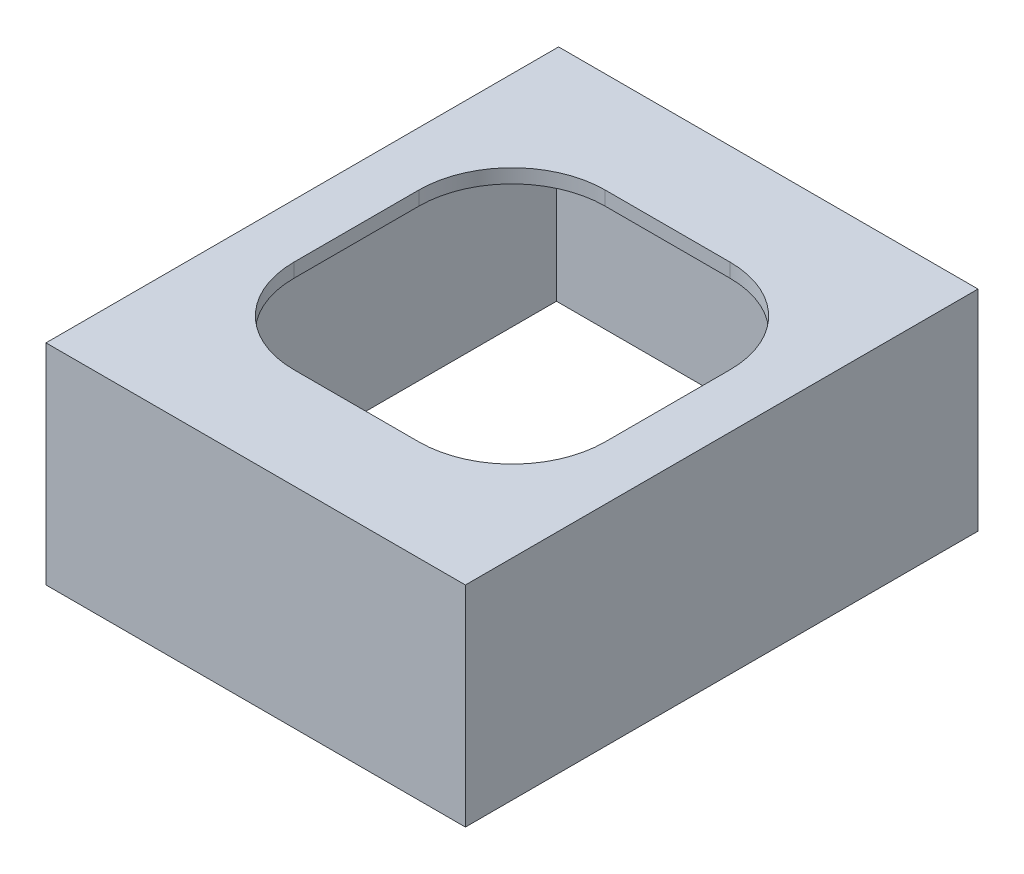
ISO-10303-21;
HEADER;
FILE_DESCRIPTION(('STEP AP214'),'2;1');
FILE_NAME('part.step','',(''),(''),'','','');
FILE_SCHEMA(('AUTOMOTIVE_DESIGN { 1 0 10303 214 1 1 1 1 }'));
ENDSEC;
DATA;
#1=APPLICATION_CONTEXT('core data for automotive mechanical design processes');
#2=APPLICATION_PROTOCOL_DEFINITION('international standard','automotive_design',2000,#1);
#3=PRODUCT_CONTEXT('',#1,'mechanical');
#4=PRODUCT('Part','Part','',(#3));
#5=PRODUCT_RELATED_PRODUCT_CATEGORY('part','',(#4));
#6=PRODUCT_DEFINITION_FORMATION('','',#4);
#7=PRODUCT_DEFINITION_CONTEXT('part definition',#1,'design');
#8=PRODUCT_DEFINITION('design','',#6,#7);
#9=PRODUCT_DEFINITION_SHAPE('','',#8);
#10=(LENGTH_UNIT() NAMED_UNIT(*) SI_UNIT(.MILLI.,.METRE.));
#11=(NAMED_UNIT(*) PLANE_ANGLE_UNIT() SI_UNIT($,.RADIAN.));
#12=(NAMED_UNIT(*) SI_UNIT($,.STERADIAN.) SOLID_ANGLE_UNIT());
#13=UNCERTAINTY_MEASURE_WITH_UNIT(LENGTH_MEASURE(1.E-05),#10,'distance_accuracy_value','');
#14=(GEOMETRIC_REPRESENTATION_CONTEXT(3) GLOBAL_UNCERTAINTY_ASSIGNED_CONTEXT((#13)) GLOBAL_UNIT_ASSIGNED_CONTEXT((#10,
#11,#12)) REPRESENTATION_CONTEXT('',''));
#15=CARTESIAN_POINT('',(0.,0.,0.));
#16=DIRECTION('',(0.,0.,1.));
#17=DIRECTION('',(1.,0.,0.));
#18=AXIS2_PLACEMENT_3D('',#15,#16,#17);
#19=CARTESIAN_POINT('',(45.,9.45,55.));
#20=DIRECTION('',(1.,0.,0.));
#21=DIRECTION('',(0.,0.,-1.));
#22=AXIS2_PLACEMENT_3D('',#19,#20,#21);
#23=PLANE('',#22);
#24=DIRECTION('',(0.,0.,-1.));
#25=VECTOR('',#24,1.);
#26=CARTESIAN_POINT('',(45.,12.45,55.));
#27=LINE('',#26,#25);
#28=CARTESIAN_POINT('',(45.,12.45,55.));
#29=VERTEX_POINT('',#28);
#30=CARTESIAN_POINT('',(45.,12.45,-55.));
#31=VERTEX_POINT('',#30);
#32=EDGE_CURVE('E243',#29,#31,#27,.T.);
#33=ORIENTED_EDGE('',*,*,#32,.F.);
#34=DIRECTION('',(0.,1.,0.));
#35=VECTOR('',#34,1.);
#36=CARTESIAN_POINT('',(45.,9.45,55.));
#37=LINE('',#36,#35);
#38=CARTESIAN_POINT('',(45.,-32.55,55.));
#39=VERTEX_POINT('',#38);
#40=EDGE_CURVE('E11',#39,#29,#37,.T.);
#41=ORIENTED_EDGE('',*,*,#40,.F.);
#42=DIRECTION('',(0.,0.,1.));
#43=VECTOR('',#42,1.);
#44=CARTESIAN_POINT('',(45.,-32.55,55.));
#45=LINE('',#44,#43);
#46=CARTESIAN_POINT('',(45.,-32.55,-55.));
#47=VERTEX_POINT('',#46);
#48=EDGE_CURVE('E160',#47,#39,#45,.T.);
#49=ORIENTED_EDGE('',*,*,#48,.F.);
#50=DIRECTION('',(0.,1.,0.));
#51=VECTOR('',#50,1.);
#52=CARTESIAN_POINT('',(45.,9.45,-55.));
#53=LINE('',#52,#51);
#54=EDGE_CURVE('E36',#47,#31,#53,.T.);
#55=ORIENTED_EDGE('',*,*,#54,.T.);
#56=EDGE_LOOP('',(#33,#41,#49,#55));
#57=FACE_BOUND('',#56,.T.);
#58=ADVANCED_FACE('F33',(#57),#23,.T.);
#59=CARTESIAN_POINT('',(-45.,9.45,55.));
#60=DIRECTION('',(0.,0.,1.));
#61=DIRECTION('',(1.,0.,0.));
#62=AXIS2_PLACEMENT_3D('',#59,#60,#61);
#63=PLANE('',#62);
#64=DIRECTION('',(1.,0.,0.));
#65=VECTOR('',#64,1.);
#66=CARTESIAN_POINT('',(-45.,12.45,55.));
#67=LINE('',#66,#65);
#68=CARTESIAN_POINT('',(-45.,12.45,55.));
#69=VERTEX_POINT('',#68);
#70=EDGE_CURVE('E266',#69,#29,#67,.T.);
#71=ORIENTED_EDGE('',*,*,#70,.F.);
#72=DIRECTION('',(0.,1.,0.));
#73=VECTOR('',#72,1.);
#74=CARTESIAN_POINT('',(-45.,9.45,55.));
#75=LINE('',#74,#73);
#76=CARTESIAN_POINT('',(-45.,-32.55,55.));
#77=VERTEX_POINT('',#76);
#78=EDGE_CURVE('E41',#77,#69,#75,.T.);
#79=ORIENTED_EDGE('',*,*,#78,.F.);
#80=DIRECTION('',(-1.,0.,0.));
#81=VECTOR('',#80,1.);
#82=CARTESIAN_POINT('',(-45.,-32.55,55.));
#83=LINE('',#82,#81);
#84=EDGE_CURVE('E184',#39,#77,#83,.T.);
#85=ORIENTED_EDGE('',*,*,#84,.F.);
#86=ORIENTED_EDGE('',*,*,#40,.T.);
#87=EDGE_LOOP('',(#71,#79,#85,#86));
#88=FACE_BOUND('',#87,.T.);
#89=ADVANCED_FACE('F282',(#88),#63,.T.);
#90=CARTESIAN_POINT('',(-45.,9.45,55.));
#91=DIRECTION('',(-1.,0.,0.));
#92=DIRECTION('',(0.,0.,1.));
#93=AXIS2_PLACEMENT_3D('',#90,#91,#92);
#94=PLANE('',#93);
#95=DIRECTION('',(0.,0.,1.));
#96=VECTOR('',#95,1.);
#97=CARTESIAN_POINT('',(-45.,12.45,55.));
#98=LINE('',#97,#96);
#99=CARTESIAN_POINT('',(-45.,12.45,-55.));
#100=VERTEX_POINT('',#99);
#101=EDGE_CURVE('E263',#100,#69,#98,.T.);
#102=ORIENTED_EDGE('',*,*,#101,.F.);
#103=DIRECTION('',(0.,1.,0.));
#104=VECTOR('',#103,1.);
#105=CARTESIAN_POINT('',(-45.,9.45,-55.));
#106=LINE('',#105,#104);
#107=CARTESIAN_POINT('',(-45.,-32.55,-55.));
#108=VERTEX_POINT('',#107);
#109=EDGE_CURVE('E269',#108,#100,#106,.T.);
#110=ORIENTED_EDGE('',*,*,#109,.F.);
#111=DIRECTION('',(0.,0.,-1.));
#112=VECTOR('',#111,1.);
#113=CARTESIAN_POINT('',(-45.,-32.55,55.));
#114=LINE('',#113,#112);
#115=EDGE_CURVE('E187',#77,#108,#114,.T.);
#116=ORIENTED_EDGE('',*,*,#115,.F.);
#117=ORIENTED_EDGE('',*,*,#78,.T.);
#118=EDGE_LOOP('',(#102,#110,#116,#117));
#119=FACE_BOUND('',#118,.T.);
#120=ADVANCED_FACE('F287',(#119),#94,.T.);
#121=CARTESIAN_POINT('',(-45.,9.45,-55.));
#122=DIRECTION('',(0.,0.,-1.));
#123=DIRECTION('',(-1.,0.,0.));
#124=AXIS2_PLACEMENT_3D('',#121,#122,#123);
#125=PLANE('',#124);
#126=DIRECTION('',(-1.,0.,0.));
#127=VECTOR('',#126,1.);
#128=CARTESIAN_POINT('',(-45.,12.45,-55.));
#129=LINE('',#128,#127);
#130=EDGE_CURVE('E260',#31,#100,#129,.T.);
#131=ORIENTED_EDGE('',*,*,#130,.F.);
#132=ORIENTED_EDGE('',*,*,#54,.F.);
#133=DIRECTION('',(1.,0.,0.));
#134=VECTOR('',#133,1.);
#135=CARTESIAN_POINT('',(-45.,-32.55,-55.));
#136=LINE('',#135,#134);
#137=EDGE_CURVE('E190',#108,#47,#136,.T.);
#138=ORIENTED_EDGE('',*,*,#137,.F.);
#139=ORIENTED_EDGE('',*,*,#109,.T.);
#140=EDGE_LOOP('',(#131,#132,#138,#139));
#141=FACE_BOUND('',#140,.T.);
#142=ADVANCED_FACE('F277',(#141),#125,.T.);
#143=CARTESIAN_POINT('',(0.,9.45,0.));
#144=DIRECTION('',(0.,-1.,0.));
#145=DIRECTION('',(0.,0.,-1.));
#146=AXIS2_PLACEMENT_3D('',#143,#144,#145);
#147=PLANE('',#146);
#148=DIRECTION('',(0.,0.,1.));
#149=VECTOR('',#148,1.);
#150=CARTESIAN_POINT('',(42.9545454545455,9.45,52.5));
#151=LINE('',#150,#149);
#152=CARTESIAN_POINT('',(42.9545454545455,9.45,-52.5));
#153=VERTEX_POINT('',#152);
#154=CARTESIAN_POINT('',(42.9545454545455,9.45,52.5));
#155=VERTEX_POINT('',#154);
#156=EDGE_CURVE('E49',#153,#155,#151,.T.);
#157=ORIENTED_EDGE('',*,*,#156,.T.);
#158=DIRECTION('',(-1.,0.,0.));
#159=VECTOR('',#158,1.);
#160=CARTESIAN_POINT('',(-42.9545454545455,9.45,52.5));
#161=LINE('',#160,#159);
#162=CARTESIAN_POINT('',(-42.9545454545455,9.45,52.5));
#163=VERTEX_POINT('',#162);
#164=EDGE_CURVE('E53',#155,#163,#161,.T.);
#165=ORIENTED_EDGE('',*,*,#164,.T.);
#166=DIRECTION('',(0.,0.,-1.));
#167=VECTOR('',#166,1.);
#168=CARTESIAN_POINT('',(-42.9545454545455,9.45,52.5));
#169=LINE('',#168,#167);
#170=CARTESIAN_POINT('',(-42.9545454545455,9.45,-52.5));
#171=VERTEX_POINT('',#170);
#172=EDGE_CURVE('E174',#163,#171,#169,.T.);
#173=ORIENTED_EDGE('',*,*,#172,.T.);
#174=DIRECTION('',(1.,0.,0.));
#175=VECTOR('',#174,1.);
#176=CARTESIAN_POINT('',(-42.9545454545455,9.45,-52.5));
#177=LINE('',#176,#175);
#178=EDGE_CURVE('E155',#171,#153,#177,.T.);
#179=ORIENTED_EDGE('',*,*,#178,.T.);
#180=EDGE_LOOP('',(#157,#165,#173,#179));
#181=FACE_BOUND('',#180,.T.);
#182=CARTESIAN_POINT('',(-13.4,9.45,-13.3999991416931));
#183=DIRECTION('',(0.,1.,0.));
#184=DIRECTION('',(0.,0.,1.));
#185=AXIS2_PLACEMENT_3D('',#182,#183,#184);
#186=CIRCLE('',#185,20.);
#187=CARTESIAN_POINT('',(-13.3999999999999,9.45,-33.3999991416931));
#188=VERTEX_POINT('',#187);
#189=CARTESIAN_POINT('',(-33.4,9.45,-13.399999141693));
#190=VERTEX_POINT('',#189);
#191=EDGE_CURVE('E194',#188,#190,#186,.T.);
#192=ORIENTED_EDGE('',*,*,#191,.T.);
#193=DIRECTION('',(0.,0.,1.));
#194=VECTOR('',#193,1.);
#195=CARTESIAN_POINT('',(-33.4,9.45,-13.399999141693));
#196=LINE('',#195,#194);
#197=CARTESIAN_POINT('',(-33.4,9.45,13.399999141693));
#198=VERTEX_POINT('',#197);
#199=EDGE_CURVE('E197',#190,#198,#196,.T.);
#200=ORIENTED_EDGE('',*,*,#199,.T.);
#201=CARTESIAN_POINT('',(-13.4,9.45,13.3999991416931));
#202=DIRECTION('',(0.,1.,0.));
#203=DIRECTION('',(0.,0.,1.));
#204=AXIS2_PLACEMENT_3D('',#201,#202,#203);
#205=CIRCLE('',#204,20.);
#206=CARTESIAN_POINT('',(-13.3999999999998,9.45,33.3999991416931));
#207=VERTEX_POINT('',#206);
#208=EDGE_CURVE('E201',#198,#207,#205,.T.);
#209=ORIENTED_EDGE('',*,*,#208,.T.);
#210=DIRECTION('',(1.,0.,0.));
#211=VECTOR('',#210,1.);
#212=CARTESIAN_POINT('',(-13.3999999999998,9.45,33.3999991416931));
#213=LINE('',#212,#211);
#214=CARTESIAN_POINT('',(13.3999999999999,9.45,33.3999991416931));
#215=VERTEX_POINT('',#214);
#216=EDGE_CURVE('E204',#207,#215,#213,.T.);
#217=ORIENTED_EDGE('',*,*,#216,.T.);
#218=CARTESIAN_POINT('',(13.4,9.45,13.3999991416931));
#219=DIRECTION('',(0.,1.,0.));
#220=DIRECTION('',(0.,0.,1.));
#221=AXIS2_PLACEMENT_3D('',#218,#219,#220);
#222=CIRCLE('',#221,20.);
#223=CARTESIAN_POINT('',(33.4,9.45,13.399999141693));
#224=VERTEX_POINT('',#223);
#225=EDGE_CURVE('E207',#215,#224,#222,.T.);
#226=ORIENTED_EDGE('',*,*,#225,.T.);
#227=DIRECTION('',(0.,0.,-1.));
#228=VECTOR('',#227,1.);
#229=CARTESIAN_POINT('',(33.4,9.45,-13.399999141693));
#230=LINE('',#229,#228);
#231=CARTESIAN_POINT('',(33.4,9.45,-13.399999141693));
#232=VERTEX_POINT('',#231);
#233=EDGE_CURVE('E210',#224,#232,#230,.T.);
#234=ORIENTED_EDGE('',*,*,#233,.T.);
#235=CARTESIAN_POINT('',(13.4,9.45,-13.3999991416931));
#236=DIRECTION('',(0.,1.,0.));
#237=DIRECTION('',(0.,0.,-1.));
#238=AXIS2_PLACEMENT_3D('',#235,#236,#237);
#239=CIRCLE('',#238,20.);
#240=CARTESIAN_POINT('',(13.3999999999999,9.45,-33.3999991416931));
#241=VERTEX_POINT('',#240);
#242=EDGE_CURVE('E213',#232,#241,#239,.T.);
#243=ORIENTED_EDGE('',*,*,#242,.T.);
#244=DIRECTION('',(-1.,0.,0.));
#245=VECTOR('',#244,1.);
#246=CARTESIAN_POINT('',(-13.3999999999999,9.45,-33.3999991416931));
#247=LINE('',#246,#245);
#248=EDGE_CURVE('E216',#241,#188,#247,.T.);
#249=ORIENTED_EDGE('',*,*,#248,.T.);
#250=EDGE_LOOP('',(#192,#200,#209,#217,#226,#234,#243,#249));
#251=FACE_BOUND('',#250,.T.);
#252=ADVANCED_FACE('F294',(#181,#251),#147,.T.);
#253=CARTESIAN_POINT('',(0.,12.45,0.));
#254=DIRECTION('',(0.,-1.,0.));
#255=DIRECTION('',(0.,0.,-1.));
#256=AXIS2_PLACEMENT_3D('',#253,#254,#255);
#257=PLANE('',#256);
#258=DIRECTION('',(0.,0.,1.));
#259=VECTOR('',#258,1.);
#260=CARTESIAN_POINT('',(-33.4,12.45,-13.399999141693));
#261=LINE('',#260,#259);
#262=CARTESIAN_POINT('',(-33.4,12.45,-13.399999141693));
#263=VERTEX_POINT('',#262);
#264=CARTESIAN_POINT('',(-33.4,12.45,13.399999141693));
#265=VERTEX_POINT('',#264);
#266=EDGE_CURVE('E221',#263,#265,#261,.T.);
#267=ORIENTED_EDGE('',*,*,#266,.F.);
#268=CARTESIAN_POINT('',(-13.4,12.45,-13.3999991416931));
#269=DIRECTION('',(0.,1.,0.));
#270=DIRECTION('',(0.,0.,1.));
#271=AXIS2_PLACEMENT_3D('',#268,#269,#270);
#272=CIRCLE('',#271,20.);
#273=CARTESIAN_POINT('',(-13.3999999999999,12.45,-33.3999991416931));
#274=VERTEX_POINT('',#273);
#275=EDGE_CURVE('E193',#274,#263,#272,.T.);
#276=ORIENTED_EDGE('',*,*,#275,.F.);
#277=DIRECTION('',(-1.,0.,0.));
#278=VECTOR('',#277,1.);
#279=CARTESIAN_POINT('',(-13.3999999999999,12.45,-33.3999991416931));
#280=LINE('',#279,#278);
#281=CARTESIAN_POINT('',(13.3999999999999,12.45,-33.3999991416931));
#282=VERTEX_POINT('',#281);
#283=EDGE_CURVE('E198',#282,#274,#280,.T.);
#284=ORIENTED_EDGE('',*,*,#283,.F.);
#285=CARTESIAN_POINT('',(13.4,12.45,-13.3999991416931));
#286=DIRECTION('',(0.,1.,0.));
#287=DIRECTION('',(0.,0.,-1.));
#288=AXIS2_PLACEMENT_3D('',#285,#286,#287);
#289=CIRCLE('',#288,20.);
#290=CARTESIAN_POINT('',(33.4,12.45,-13.399999141693));
#291=VERTEX_POINT('',#290);
#292=EDGE_CURVE('E236',#291,#282,#289,.T.);
#293=ORIENTED_EDGE('',*,*,#292,.F.);
#294=DIRECTION('',(0.,0.,-1.));
#295=VECTOR('',#294,1.);
#296=CARTESIAN_POINT('',(33.4,12.45,-13.399999141693));
#297=LINE('',#296,#295);
#298=CARTESIAN_POINT('',(33.4,12.45,13.399999141693));
#299=VERTEX_POINT('',#298);
#300=EDGE_CURVE('E233',#299,#291,#297,.T.);
#301=ORIENTED_EDGE('',*,*,#300,.F.);
#302=CARTESIAN_POINT('',(13.4,12.45,13.3999991416931));
#303=DIRECTION('',(0.,1.,0.));
#304=DIRECTION('',(0.,0.,1.));
#305=AXIS2_PLACEMENT_3D('',#302,#303,#304);
#306=CIRCLE('',#305,20.);
#307=CARTESIAN_POINT('',(13.3999999999999,12.45,33.3999991416931));
#308=VERTEX_POINT('',#307);
#309=EDGE_CURVE('E230',#308,#299,#306,.T.);
#310=ORIENTED_EDGE('',*,*,#309,.F.);
#311=DIRECTION('',(1.,0.,0.));
#312=VECTOR('',#311,1.);
#313=CARTESIAN_POINT('',(-13.3999999999998,12.45,33.3999991416931));
#314=LINE('',#313,#312);
#315=CARTESIAN_POINT('',(-13.3999999999998,12.45,33.3999991416931));
#316=VERTEX_POINT('',#315);
#317=EDGE_CURVE('E227',#316,#308,#314,.T.);
#318=ORIENTED_EDGE('',*,*,#317,.F.);
#319=CARTESIAN_POINT('',(-13.4,12.45,13.3999991416931));
#320=DIRECTION('',(0.,1.,0.));
#321=DIRECTION('',(0.,0.,1.));
#322=AXIS2_PLACEMENT_3D('',#319,#320,#321);
#323=CIRCLE('',#322,20.);
#324=EDGE_CURVE('E224',#265,#316,#323,.T.);
#325=ORIENTED_EDGE('',*,*,#324,.F.);
#326=EDGE_LOOP('',(#267,#276,#284,#293,#301,#310,#318,#325));
#327=FACE_BOUND('',#326,.T.);
#328=ORIENTED_EDGE('',*,*,#32,.T.);
#329=ORIENTED_EDGE('',*,*,#130,.T.);
#330=ORIENTED_EDGE('',*,*,#101,.T.);
#331=ORIENTED_EDGE('',*,*,#70,.T.);
#332=EDGE_LOOP('',(#328,#329,#330,#331));
#333=FACE_BOUND('',#332,.T.);
#334=ADVANCED_FACE('F279',(#327,#333),#257,.F.);
#335=CARTESIAN_POINT('',(-13.4,9.45,-13.3999991416931));
#336=DIRECTION('',(0.,1.,0.));
#337=DIRECTION('',(0.,0.,1.));
#338=AXIS2_PLACEMENT_3D('',#335,#336,#337);
#339=CYLINDRICAL_SURFACE('',#338,20.);
#340=ORIENTED_EDGE('',*,*,#275,.T.);
#341=DIRECTION('',(0.,1.,0.));
#342=VECTOR('',#341,1.);
#343=CARTESIAN_POINT('',(-33.4,9.45,-13.399999141693));
#344=LINE('',#343,#342);
#345=EDGE_CURVE('E219',#190,#263,#344,.T.);
#346=ORIENTED_EDGE('',*,*,#345,.F.);
#347=ORIENTED_EDGE('',*,*,#191,.F.);
#348=DIRECTION('',(0.,1.,0.));
#349=VECTOR('',#348,1.);
#350=CARTESIAN_POINT('',(-13.3999999999999,9.45,-33.3999991416931));
#351=LINE('',#350,#349);
#352=EDGE_CURVE('E241',#188,#274,#351,.T.);
#353=ORIENTED_EDGE('',*,*,#352,.T.);
#354=EDGE_LOOP('',(#340,#346,#347,#353));
#355=FACE_BOUND('',#354,.T.);
#356=ADVANCED_FACE('F383',(#355),#339,.F.);
#357=CARTESIAN_POINT('',(-13.3999999999999,9.45,-33.3999991416931));
#358=DIRECTION('',(0.,0.,-1.));
#359=DIRECTION('',(-1.,0.,0.));
#360=AXIS2_PLACEMENT_3D('',#357,#358,#359);
#361=PLANE('',#360);
#362=ORIENTED_EDGE('',*,*,#283,.T.);
#363=ORIENTED_EDGE('',*,*,#352,.F.);
#364=ORIENTED_EDGE('',*,*,#248,.F.);
#365=DIRECTION('',(0.,1.,0.));
#366=VECTOR('',#365,1.);
#367=CARTESIAN_POINT('',(13.3999999999999,9.45,-33.3999991416931));
#368=LINE('',#367,#366);
#369=EDGE_CURVE('E244',#241,#282,#368,.T.);
#370=ORIENTED_EDGE('',*,*,#369,.T.);
#371=EDGE_LOOP('',(#362,#363,#364,#370));
#372=FACE_BOUND('',#371,.T.);
#373=ADVANCED_FACE('F379',(#372),#361,.F.);
#374=CARTESIAN_POINT('',(13.4,9.45,-13.3999991416931));
#375=DIRECTION('',(0.,1.,0.));
#376=DIRECTION('',(0.,0.,1.));
#377=AXIS2_PLACEMENT_3D('',#374,#375,#376);
#378=CYLINDRICAL_SURFACE('',#377,20.);
#379=ORIENTED_EDGE('',*,*,#292,.T.);
#380=ORIENTED_EDGE('',*,*,#369,.F.);
#381=ORIENTED_EDGE('',*,*,#242,.F.);
#382=DIRECTION('',(0.,1.,0.));
#383=VECTOR('',#382,1.);
#384=CARTESIAN_POINT('',(33.4,9.45,-13.399999141693));
#385=LINE('',#384,#383);
#386=EDGE_CURVE('E246',#232,#291,#385,.T.);
#387=ORIENTED_EDGE('',*,*,#386,.T.);
#388=EDGE_LOOP('',(#379,#380,#381,#387));
#389=FACE_BOUND('',#388,.T.);
#390=ADVANCED_FACE('F382',(#389),#378,.F.);
#391=CARTESIAN_POINT('',(33.4,9.45,-13.399999141693));
#392=DIRECTION('',(1.,0.,0.));
#393=DIRECTION('',(0.,0.,-1.));
#394=AXIS2_PLACEMENT_3D('',#391,#392,#393);
#395=PLANE('',#394);
#396=ORIENTED_EDGE('',*,*,#300,.T.);
#397=ORIENTED_EDGE('',*,*,#386,.F.);
#398=ORIENTED_EDGE('',*,*,#233,.F.);
#399=DIRECTION('',(0.,1.,0.));
#400=VECTOR('',#399,1.);
#401=CARTESIAN_POINT('',(33.4,9.45,13.399999141693));
#402=LINE('',#401,#400);
#403=EDGE_CURVE('E248',#224,#299,#402,.T.);
#404=ORIENTED_EDGE('',*,*,#403,.T.);
#405=EDGE_LOOP('',(#396,#397,#398,#404));
#406=FACE_BOUND('',#405,.T.);
#407=ADVANCED_FACE('F387',(#406),#395,.F.);
#408=CARTESIAN_POINT('',(13.4,9.45,13.3999991416931));
#409=DIRECTION('',(0.,1.,0.));
#410=DIRECTION('',(0.,0.,1.));
#411=AXIS2_PLACEMENT_3D('',#408,#409,#410);
#412=CYLINDRICAL_SURFACE('',#411,20.);
#413=ORIENTED_EDGE('',*,*,#309,.T.);
#414=ORIENTED_EDGE('',*,*,#403,.F.);
#415=ORIENTED_EDGE('',*,*,#225,.F.);
#416=DIRECTION('',(0.,1.,0.));
#417=VECTOR('',#416,1.);
#418=CARTESIAN_POINT('',(13.3999999999999,9.45,33.3999991416931));
#419=LINE('',#418,#417);
#420=EDGE_CURVE('E250',#215,#308,#419,.T.);
#421=ORIENTED_EDGE('',*,*,#420,.T.);
#422=EDGE_LOOP('',(#413,#414,#415,#421));
#423=FACE_BOUND('',#422,.T.);
#424=ADVANCED_FACE('F391',(#423),#412,.F.);
#425=CARTESIAN_POINT('',(-13.3999999999998,9.45,33.3999991416931));
#426=DIRECTION('',(0.,0.,1.));
#427=DIRECTION('',(1.,0.,0.));
#428=AXIS2_PLACEMENT_3D('',#425,#426,#427);
#429=PLANE('',#428);
#430=ORIENTED_EDGE('',*,*,#317,.T.);
#431=ORIENTED_EDGE('',*,*,#420,.F.);
#432=ORIENTED_EDGE('',*,*,#216,.F.);
#433=DIRECTION('',(0.,1.,0.));
#434=VECTOR('',#433,1.);
#435=CARTESIAN_POINT('',(-13.3999999999998,9.45,33.3999991416931));
#436=LINE('',#435,#434);
#437=EDGE_CURVE('E252',#207,#316,#436,.T.);
#438=ORIENTED_EDGE('',*,*,#437,.T.);
#439=EDGE_LOOP('',(#430,#431,#432,#438));
#440=FACE_BOUND('',#439,.T.);
#441=ADVANCED_FACE('F395',(#440),#429,.F.);
#442=CARTESIAN_POINT('',(-13.4,9.45,13.3999991416931));
#443=DIRECTION('',(0.,1.,0.));
#444=DIRECTION('',(0.,0.,1.));
#445=AXIS2_PLACEMENT_3D('',#442,#443,#444);
#446=CYLINDRICAL_SURFACE('',#445,20.);
#447=ORIENTED_EDGE('',*,*,#324,.T.);
#448=ORIENTED_EDGE('',*,*,#437,.F.);
#449=ORIENTED_EDGE('',*,*,#208,.F.);
#450=DIRECTION('',(0.,1.,0.));
#451=VECTOR('',#450,1.);
#452=CARTESIAN_POINT('',(-33.4,9.45,13.399999141693));
#453=LINE('',#452,#451);
#454=EDGE_CURVE('E254',#198,#265,#453,.T.);
#455=ORIENTED_EDGE('',*,*,#454,.T.);
#456=EDGE_LOOP('',(#447,#448,#449,#455));
#457=FACE_BOUND('',#456,.T.);
#458=ADVANCED_FACE('F399',(#457),#446,.F.);
#459=CARTESIAN_POINT('',(-33.4,9.45,-13.399999141693));
#460=DIRECTION('',(-1.,0.,0.));
#461=DIRECTION('',(0.,0.,1.));
#462=AXIS2_PLACEMENT_3D('',#459,#460,#461);
#463=PLANE('',#462);
#464=ORIENTED_EDGE('',*,*,#266,.T.);
#465=ORIENTED_EDGE('',*,*,#454,.F.);
#466=ORIENTED_EDGE('',*,*,#199,.F.);
#467=ORIENTED_EDGE('',*,*,#345,.T.);
#468=EDGE_LOOP('',(#464,#465,#466,#467));
#469=FACE_BOUND('',#468,.T.);
#470=ADVANCED_FACE('F336',(#469),#463,.F.);
#471=CARTESIAN_POINT('',(0.,-32.55,0.));
#472=DIRECTION('',(0.,-1.,0.));
#473=DIRECTION('',(0.,0.,-1.));
#474=AXIS2_PLACEMENT_3D('',#471,#472,#473);
#475=PLANE('',#474);
#476=ORIENTED_EDGE('',*,*,#48,.T.);
#477=ORIENTED_EDGE('',*,*,#84,.T.);
#478=ORIENTED_EDGE('',*,*,#115,.T.);
#479=ORIENTED_EDGE('',*,*,#137,.T.);
#480=EDGE_LOOP('',(#476,#477,#478,#479));
#481=FACE_BOUND('',#480,.T.);
#482=DIRECTION('',(-1.,0.,0.));
#483=VECTOR('',#482,1.);
#484=CARTESIAN_POINT('',(-42.9545454545455,-32.55,52.5));
#485=LINE('',#484,#483);
#486=CARTESIAN_POINT('',(42.9545454545455,-32.55,52.5));
#487=VERTEX_POINT('',#486);
#488=CARTESIAN_POINT('',(-42.9545454545455,-32.55,52.5));
#489=VERTEX_POINT('',#488);
#490=EDGE_CURVE('E154',#487,#489,#485,.T.);
#491=ORIENTED_EDGE('',*,*,#490,.F.);
#492=DIRECTION('',(0.,0.,1.));
#493=VECTOR('',#492,1.);
#494=CARTESIAN_POINT('',(42.9545454545455,-32.55,52.5));
#495=LINE('',#494,#493);
#496=CARTESIAN_POINT('',(42.9545454545455,-32.55,-52.5));
#497=VERTEX_POINT('',#496);
#498=EDGE_CURVE('E145',#497,#487,#495,.T.);
#499=ORIENTED_EDGE('',*,*,#498,.F.);
#500=DIRECTION('',(1.,0.,0.));
#501=VECTOR('',#500,1.);
#502=CARTESIAN_POINT('',(-42.9545454545455,-32.55,-52.5));
#503=LINE('',#502,#501);
#504=CARTESIAN_POINT('',(-42.9545454545455,-32.55,-52.5));
#505=VERTEX_POINT('',#504);
#506=EDGE_CURVE('E168',#505,#497,#503,.T.);
#507=ORIENTED_EDGE('',*,*,#506,.F.);
#508=DIRECTION('',(0.,0.,-1.));
#509=VECTOR('',#508,1.);
#510=CARTESIAN_POINT('',(-42.9545454545455,-32.55,52.5));
#511=LINE('',#510,#509);
#512=EDGE_CURVE('E166',#489,#505,#511,.T.);
#513=ORIENTED_EDGE('',*,*,#512,.F.);
#514=EDGE_LOOP('',(#491,#499,#507,#513));
#515=FACE_BOUND('',#514,.T.);
#516=ADVANCED_FACE('F164',(#481,#515),#475,.T.);
#517=CARTESIAN_POINT('',(42.9545454545455,-32.55,52.5));
#518=DIRECTION('',(-1.,0.,0.));
#519=DIRECTION('',(0.,0.,1.));
#520=AXIS2_PLACEMENT_3D('',#517,#518,#519);
#521=PLANE('',#520);
#522=ORIENTED_EDGE('',*,*,#156,.F.);
#523=DIRECTION('',(0.,1.,0.));
#524=VECTOR('',#523,1.);
#525=CARTESIAN_POINT('',(42.9545454545455,-32.55,-52.5));
#526=LINE('',#525,#524);
#527=EDGE_CURVE('E150',#497,#153,#526,.T.);
#528=ORIENTED_EDGE('',*,*,#527,.F.);
#529=ORIENTED_EDGE('',*,*,#498,.T.);
#530=DIRECTION('',(0.,1.,0.));
#531=VECTOR('',#530,1.);
#532=CARTESIAN_POINT('',(42.9545454545455,-32.55,52.5));
#533=LINE('',#532,#531);
#534=EDGE_CURVE('E148',#487,#155,#533,.T.);
#535=ORIENTED_EDGE('',*,*,#534,.T.);
#536=EDGE_LOOP('',(#522,#528,#529,#535));
#537=FACE_BOUND('',#536,.T.);
#538=ADVANCED_FACE('F147',(#537),#521,.T.);
#539=CARTESIAN_POINT('',(-42.9545454545455,-32.55,52.5));
#540=DIRECTION('',(0.,0.,-1.));
#541=DIRECTION('',(-1.,0.,0.));
#542=AXIS2_PLACEMENT_3D('',#539,#540,#541);
#543=PLANE('',#542);
#544=ORIENTED_EDGE('',*,*,#164,.F.);
#545=ORIENTED_EDGE('',*,*,#534,.F.);
#546=ORIENTED_EDGE('',*,*,#490,.T.);
#547=DIRECTION('',(0.,1.,0.));
#548=VECTOR('',#547,1.);
#549=CARTESIAN_POINT('',(-42.9545454545455,-32.55,52.5));
#550=LINE('',#549,#548);
#551=EDGE_CURVE('E161',#489,#163,#550,.T.);
#552=ORIENTED_EDGE('',*,*,#551,.T.);
#553=EDGE_LOOP('',(#544,#545,#546,#552));
#554=FACE_BOUND('',#553,.T.);
#555=ADVANCED_FACE('F158',(#554),#543,.T.);
#556=CARTESIAN_POINT('',(-42.9545454545455,-32.55,52.5));
#557=DIRECTION('',(1.,0.,0.));
#558=DIRECTION('',(0.,0.,-1.));
#559=AXIS2_PLACEMENT_3D('',#556,#557,#558);
#560=PLANE('',#559);
#561=ORIENTED_EDGE('',*,*,#172,.F.);
#562=ORIENTED_EDGE('',*,*,#551,.F.);
#563=ORIENTED_EDGE('',*,*,#512,.T.);
#564=DIRECTION('',(0.,1.,0.));
#565=VECTOR('',#564,1.);
#566=CARTESIAN_POINT('',(-42.9545454545455,-32.55,-52.5));
#567=LINE('',#566,#565);
#568=EDGE_CURVE('E178',#505,#171,#567,.T.);
#569=ORIENTED_EDGE('',*,*,#568,.T.);
#570=EDGE_LOOP('',(#561,#562,#563,#569));
#571=FACE_BOUND('',#570,.T.);
#572=ADVANCED_FACE('F354',(#571),#560,.T.);
#573=CARTESIAN_POINT('',(-42.9545454545455,-32.55,-52.5));
#574=DIRECTION('',(0.,0.,1.));
#575=DIRECTION('',(1.,0.,0.));
#576=AXIS2_PLACEMENT_3D('',#573,#574,#575);
#577=PLANE('',#576);
#578=ORIENTED_EDGE('',*,*,#178,.F.);
#579=ORIENTED_EDGE('',*,*,#568,.F.);
#580=ORIENTED_EDGE('',*,*,#506,.T.);
#581=ORIENTED_EDGE('',*,*,#527,.T.);
#582=EDGE_LOOP('',(#578,#579,#580,#581));
#583=FACE_BOUND('',#582,.T.);
#584=ADVANCED_FACE('F363',(#583),#577,.T.);
#585=CLOSED_SHELL('',(#58,#89,#120,#142,#252,#334,#356,#373,#390,#407,#424,#441,#458,#470,#516,
#538,#555,#572,#584));
#586=MANIFOLD_SOLID_BREP('B2',#585);
#587=ADVANCED_BREP_SHAPE_REPRESENTATION('',(#18,#586),#14);
#588=SHAPE_DEFINITION_REPRESENTATION(#9,#587);
ENDSEC;
END-ISO-10303-21;
